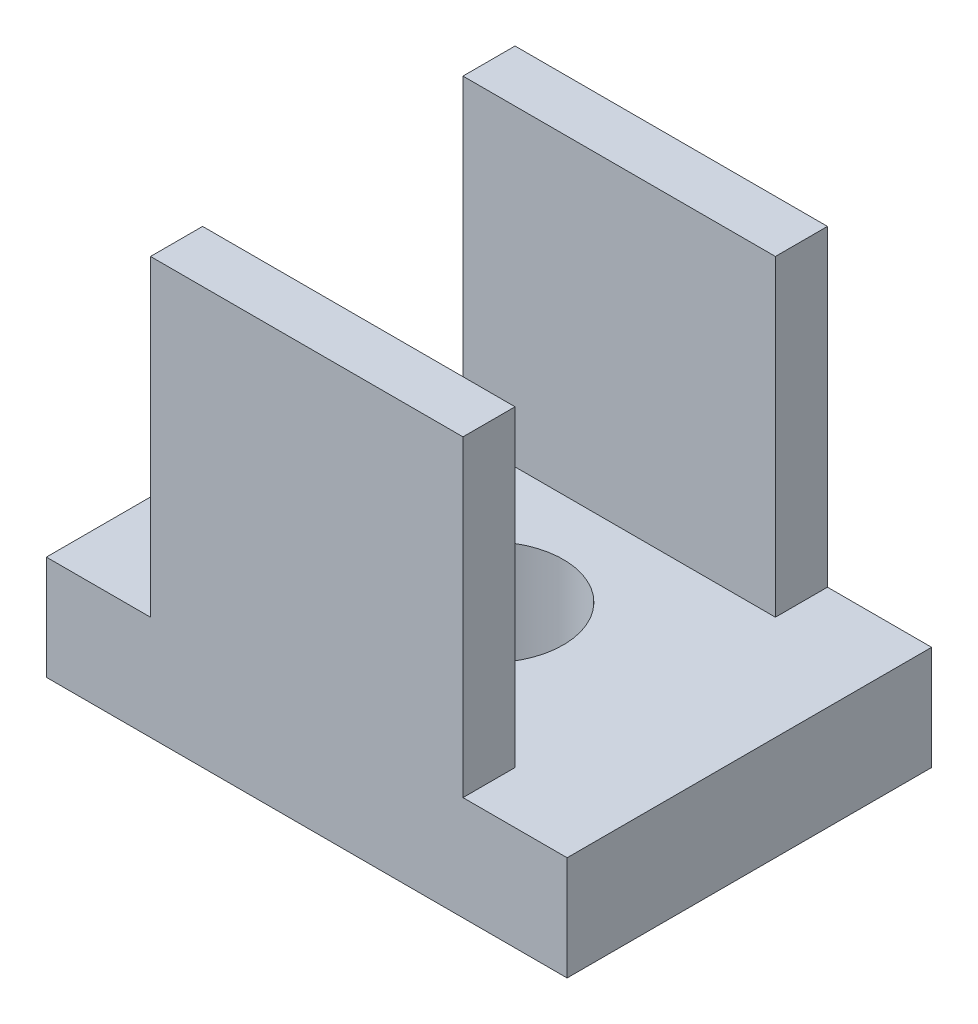
ISO-10303-21;
HEADER;
FILE_DESCRIPTION(('STEP AP214'),'2;1');
FILE_NAME('part.step','',(''),(''),'','','');
FILE_SCHEMA(('AUTOMOTIVE_DESIGN { 1 0 10303 214 1 1 1 1 }'));
ENDSEC;
DATA;
#1=APPLICATION_CONTEXT('core data for automotive mechanical design processes');
#2=APPLICATION_PROTOCOL_DEFINITION('international standard','automotive_design',2000,#1);
#3=PRODUCT_CONTEXT('',#1,'mechanical');
#4=PRODUCT('Part','Part','',(#3));
#5=PRODUCT_RELATED_PRODUCT_CATEGORY('part','',(#4));
#6=PRODUCT_DEFINITION_FORMATION('','',#4);
#7=PRODUCT_DEFINITION_CONTEXT('part definition',#1,'design');
#8=PRODUCT_DEFINITION('design','',#6,#7);
#9=PRODUCT_DEFINITION_SHAPE('','',#8);
#10=(LENGTH_UNIT() NAMED_UNIT(*) SI_UNIT(.MILLI.,.METRE.));
#11=(NAMED_UNIT(*) PLANE_ANGLE_UNIT() SI_UNIT($,.RADIAN.));
#12=(NAMED_UNIT(*) SI_UNIT($,.STERADIAN.) SOLID_ANGLE_UNIT());
#13=UNCERTAINTY_MEASURE_WITH_UNIT(LENGTH_MEASURE(1.E-05),#10,'distance_accuracy_value','');
#14=(GEOMETRIC_REPRESENTATION_CONTEXT(3) GLOBAL_UNCERTAINTY_ASSIGNED_CONTEXT((#13)) GLOBAL_UNIT_ASSIGNED_CONTEXT((#10,
#11,#12)) REPRESENTATION_CONTEXT('',''));
#15=CARTESIAN_POINT('',(0.,0.,0.));
#16=DIRECTION('',(0.,0.,1.));
#17=DIRECTION('',(1.,0.,0.));
#18=AXIS2_PLACEMENT_3D('',#15,#16,#17);
#19=CARTESIAN_POINT('',(0.,2.,0.));
#20=DIRECTION('',(0.,-1.,0.));
#21=DIRECTION('',(0.,0.,-1.));
#22=AXIS2_PLACEMENT_3D('',#19,#20,#21);
#23=PLANE('',#22);
#24=CARTESIAN_POINT('',(0.,2.,0.));
#25=DIRECTION('',(0.,1.,0.));
#26=DIRECTION('',(0.,0.,1.));
#27=AXIS2_PLACEMENT_3D('',#24,#25,#26);
#28=CIRCLE('',#27,1.425);
#29=CARTESIAN_POINT('',(0.,2.,1.425));
#30=VERTEX_POINT('',#29);
#31=EDGE_CURVE('E200',#30,#30,#28,.T.);
#32=ORIENTED_EDGE('',*,*,#31,.F.);
#33=EDGE_LOOP('',(#32));
#34=FACE_BOUND('',#33,.T.);
#35=DIRECTION('',(0.,0.,1.));
#36=VECTOR('',#35,1.);
#37=CARTESIAN_POINT('',(-3.,2.,2.5));
#38=LINE('',#37,#36);
#39=CARTESIAN_POINT('',(-3.,2.,2.5));
#40=VERTEX_POINT('',#39);
#41=CARTESIAN_POINT('',(-3.,2.,3.5));
#42=VERTEX_POINT('',#41);
#43=EDGE_CURVE('E55',#40,#42,#38,.T.);
#44=ORIENTED_EDGE('',*,*,#43,.F.);
#45=DIRECTION('',(-1.,0.,0.));
#46=VECTOR('',#45,1.);
#47=CARTESIAN_POINT('',(-3.,2.,2.5));
#48=LINE('',#47,#46);
#49=CARTESIAN_POINT('',(3.,2.,2.5));
#50=VERTEX_POINT('',#49);
#51=EDGE_CURVE('E60',#50,#40,#48,.T.);
#52=ORIENTED_EDGE('',*,*,#51,.F.);
#53=DIRECTION('',(0.,0.,-1.));
#54=VECTOR('',#53,1.);
#55=CARTESIAN_POINT('',(3.,2.,3.5));
#56=LINE('',#55,#54);
#57=CARTESIAN_POINT('',(3.,2.,3.5));
#58=VERTEX_POINT('',#57);
#59=EDGE_CURVE('E149',#58,#50,#56,.T.);
#60=ORIENTED_EDGE('',*,*,#59,.F.);
#61=DIRECTION('',(1.,0.,0.));
#62=VECTOR('',#61,1.);
#63=CARTESIAN_POINT('',(-5.,2.,3.5));
#64=LINE('',#63,#62);
#65=CARTESIAN_POINT('',(5.,2.,3.5));
#66=VERTEX_POINT('',#65);
#67=EDGE_CURVE('E221',#58,#66,#64,.T.);
#68=ORIENTED_EDGE('',*,*,#67,.T.);
#69=DIRECTION('',(0.,0.,-1.));
#70=VECTOR('',#69,1.);
#71=CARTESIAN_POINT('',(5.,2.,3.5));
#72=LINE('',#71,#70);
#73=CARTESIAN_POINT('',(5.,2.,-3.5));
#74=VERTEX_POINT('',#73);
#75=EDGE_CURVE('E209',#66,#74,#72,.T.);
#76=ORIENTED_EDGE('',*,*,#75,.T.);
#77=DIRECTION('',(-1.,0.,0.));
#78=VECTOR('',#77,1.);
#79=CARTESIAN_POINT('',(-5.,2.,-3.5));
#80=LINE('',#79,#78);
#81=CARTESIAN_POINT('',(3.,2.,-3.5));
#82=VERTEX_POINT('',#81);
#83=EDGE_CURVE('E215',#74,#82,#80,.T.);
#84=ORIENTED_EDGE('',*,*,#83,.T.);
#85=DIRECTION('',(0.,0.,-1.));
#86=VECTOR('',#85,1.);
#87=CARTESIAN_POINT('',(3.,2.,-3.5));
#88=LINE('',#87,#86);
#89=CARTESIAN_POINT('',(3.,2.,-2.5));
#90=VERTEX_POINT('',#89);
#91=EDGE_CURVE('E153',#90,#82,#88,.T.);
#92=ORIENTED_EDGE('',*,*,#91,.F.);
#93=DIRECTION('',(1.,0.,0.));
#94=VECTOR('',#93,1.);
#95=CARTESIAN_POINT('',(-3.,2.,-2.5));
#96=LINE('',#95,#94);
#97=CARTESIAN_POINT('',(-3.,2.,-2.5));
#98=VERTEX_POINT('',#97);
#99=EDGE_CURVE('E169',#98,#90,#96,.T.);
#100=ORIENTED_EDGE('',*,*,#99,.F.);
#101=DIRECTION('',(0.,0.,1.));
#102=VECTOR('',#101,1.);
#103=CARTESIAN_POINT('',(-3.,2.,-2.5));
#104=LINE('',#103,#102);
#105=CARTESIAN_POINT('',(-3.,2.,-3.5));
#106=VERTEX_POINT('',#105);
#107=EDGE_CURVE('E158',#106,#98,#104,.T.);
#108=ORIENTED_EDGE('',*,*,#107,.F.);
#109=CARTESIAN_POINT('',(-5.,2.,-3.5));
#110=VERTEX_POINT('',#109);
#111=EDGE_CURVE('E213',#106,#110,#80,.T.);
#112=ORIENTED_EDGE('',*,*,#111,.T.);
#113=DIRECTION('',(0.,0.,1.));
#114=VECTOR('',#113,1.);
#115=CARTESIAN_POINT('',(-5.,2.,3.5));
#116=LINE('',#115,#114);
#117=CARTESIAN_POINT('',(-5.,2.,3.5));
#118=VERTEX_POINT('',#117);
#119=EDGE_CURVE('E218',#110,#118,#116,.T.);
#120=ORIENTED_EDGE('',*,*,#119,.T.);
#121=EDGE_CURVE('E222',#118,#42,#64,.T.);
#122=ORIENTED_EDGE('',*,*,#121,.T.);
#123=EDGE_LOOP('',(#44,#52,#60,#68,#76,#84,#92,#100,#108,#112,#120,#122));
#124=FACE_BOUND('',#123,.T.);
#125=ADVANCED_FACE('F39',(#34,#124),#23,.F.);
#126=CARTESIAN_POINT('',(5.,2.,3.5));
#127=DIRECTION('',(-1.,0.,0.));
#128=DIRECTION('',(0.,0.,1.));
#129=AXIS2_PLACEMENT_3D('',#126,#127,#128);
#130=PLANE('',#129);
#131=DIRECTION('',(0.,0.,-1.));
#132=VECTOR('',#131,1.);
#133=CARTESIAN_POINT('',(5.,0.,3.5));
#134=LINE('',#133,#132);
#135=CARTESIAN_POINT('',(5.,0.,3.5));
#136=VERTEX_POINT('',#135);
#137=CARTESIAN_POINT('',(5.,0.,-3.5));
#138=VERTEX_POINT('',#137);
#139=EDGE_CURVE('E205',#136,#138,#134,.T.);
#140=ORIENTED_EDGE('',*,*,#139,.T.);
#141=DIRECTION('',(0.,-1.,0.));
#142=VECTOR('',#141,1.);
#143=CARTESIAN_POINT('',(5.,2.,-3.5));
#144=LINE('',#143,#142);
#145=EDGE_CURVE('E11',#74,#138,#144,.T.);
#146=ORIENTED_EDGE('',*,*,#145,.F.);
#147=ORIENTED_EDGE('',*,*,#75,.F.);
#148=DIRECTION('',(0.,-1.,0.));
#149=VECTOR('',#148,1.);
#150=CARTESIAN_POINT('',(5.,2.,3.5));
#151=LINE('',#150,#149);
#152=EDGE_CURVE('E225',#66,#136,#151,.T.);
#153=ORIENTED_EDGE('',*,*,#152,.T.);
#154=EDGE_LOOP('',(#140,#146,#147,#153));
#155=FACE_BOUND('',#154,.T.);
#156=ADVANCED_FACE('F41',(#155),#130,.F.);
#157=CARTESIAN_POINT('',(-5.,2.,-3.5));
#158=DIRECTION('',(0.,0.,1.));
#159=DIRECTION('',(1.,0.,0.));
#160=AXIS2_PLACEMENT_3D('',#157,#158,#159);
#161=PLANE('',#160);
#162=DIRECTION('',(-1.,0.,0.));
#163=VECTOR('',#162,1.);
#164=CARTESIAN_POINT('',(-5.,0.,-3.5));
#165=LINE('',#164,#163);
#166=CARTESIAN_POINT('',(-5.,0.,-3.5));
#167=VERTEX_POINT('',#166);
#168=EDGE_CURVE('E229',#138,#167,#165,.T.);
#169=ORIENTED_EDGE('',*,*,#168,.T.);
#170=DIRECTION('',(0.,-1.,0.));
#171=VECTOR('',#170,1.);
#172=CARTESIAN_POINT('',(-5.,2.,-3.5));
#173=LINE('',#172,#171);
#174=EDGE_CURVE('E48',#110,#167,#173,.T.);
#175=ORIENTED_EDGE('',*,*,#174,.F.);
#176=ORIENTED_EDGE('',*,*,#111,.F.);
#177=DIRECTION('',(0.,-1.,0.));
#178=VECTOR('',#177,1.);
#179=CARTESIAN_POINT('',(-3.,8.,-3.5));
#180=LINE('',#179,#178);
#181=CARTESIAN_POINT('',(-3.,8.,-3.5));
#182=VERTEX_POINT('',#181);
#183=EDGE_CURVE('E192',#182,#106,#180,.T.);
#184=ORIENTED_EDGE('',*,*,#183,.F.);
#185=DIRECTION('',(-1.,0.,0.));
#186=VECTOR('',#185,1.);
#187=CARTESIAN_POINT('',(-3.,8.,-3.5));
#188=LINE('',#187,#186);
#189=CARTESIAN_POINT('',(3.,8.,-3.5));
#190=VERTEX_POINT('',#189);
#191=EDGE_CURVE('E168',#190,#182,#188,.T.);
#192=ORIENTED_EDGE('',*,*,#191,.F.);
#193=DIRECTION('',(0.,-1.,0.));
#194=VECTOR('',#193,1.);
#195=CARTESIAN_POINT('',(3.,8.,-3.5));
#196=LINE('',#195,#194);
#197=EDGE_CURVE('E196',#190,#82,#196,.T.);
#198=ORIENTED_EDGE('',*,*,#197,.T.);
#199=ORIENTED_EDGE('',*,*,#83,.F.);
#200=ORIENTED_EDGE('',*,*,#145,.T.);
#201=EDGE_LOOP('',(#169,#175,#176,#184,#192,#198,#199,#200));
#202=FACE_BOUND('',#201,.T.);
#203=ADVANCED_FACE('F269',(#202),#161,.F.);
#204=CARTESIAN_POINT('',(-5.,2.,3.5));
#205=DIRECTION('',(1.,0.,0.));
#206=DIRECTION('',(0.,0.,-1.));
#207=AXIS2_PLACEMENT_3D('',#204,#205,#206);
#208=PLANE('',#207);
#209=DIRECTION('',(0.,0.,1.));
#210=VECTOR('',#209,1.);
#211=CARTESIAN_POINT('',(-5.,0.,3.5));
#212=LINE('',#211,#210);
#213=CARTESIAN_POINT('',(-5.,0.,3.5));
#214=VERTEX_POINT('',#213);
#215=EDGE_CURVE('E232',#167,#214,#212,.T.);
#216=ORIENTED_EDGE('',*,*,#215,.T.);
#217=DIRECTION('',(0.,-1.,0.));
#218=VECTOR('',#217,1.);
#219=CARTESIAN_POINT('',(-5.,2.,3.5));
#220=LINE('',#219,#218);
#221=EDGE_CURVE('E240',#118,#214,#220,.T.);
#222=ORIENTED_EDGE('',*,*,#221,.F.);
#223=ORIENTED_EDGE('',*,*,#119,.F.);
#224=ORIENTED_EDGE('',*,*,#174,.T.);
#225=EDGE_LOOP('',(#216,#222,#223,#224));
#226=FACE_BOUND('',#225,.T.);
#227=ADVANCED_FACE('F249',(#226),#208,.F.);
#228=CARTESIAN_POINT('',(-5.,2.,3.5));
#229=DIRECTION('',(0.,0.,-1.));
#230=DIRECTION('',(-1.,0.,0.));
#231=AXIS2_PLACEMENT_3D('',#228,#229,#230);
#232=PLANE('',#231);
#233=DIRECTION('',(1.,0.,0.));
#234=VECTOR('',#233,1.);
#235=CARTESIAN_POINT('',(-5.,0.,3.5));
#236=LINE('',#235,#234);
#237=EDGE_CURVE('E214',#214,#136,#236,.T.);
#238=ORIENTED_EDGE('',*,*,#237,.T.);
#239=ORIENTED_EDGE('',*,*,#152,.F.);
#240=ORIENTED_EDGE('',*,*,#67,.F.);
#241=DIRECTION('',(0.,-1.,0.));
#242=VECTOR('',#241,1.);
#243=CARTESIAN_POINT('',(3.,8.,3.5));
#244=LINE('',#243,#242);
#245=CARTESIAN_POINT('',(3.,8.,3.5));
#246=VERTEX_POINT('',#245);
#247=EDGE_CURVE('E160',#246,#58,#244,.T.);
#248=ORIENTED_EDGE('',*,*,#247,.F.);
#249=DIRECTION('',(1.,0.,0.));
#250=VECTOR('',#249,1.);
#251=CARTESIAN_POINT('',(-3.,8.,3.5));
#252=LINE('',#251,#250);
#253=CARTESIAN_POINT('',(-3.,8.,3.5));
#254=VERTEX_POINT('',#253);
#255=EDGE_CURVE('E138',#254,#246,#252,.T.);
#256=ORIENTED_EDGE('',*,*,#255,.F.);
#257=DIRECTION('',(0.,-1.,0.));
#258=VECTOR('',#257,1.);
#259=CARTESIAN_POINT('',(-3.,8.,3.5));
#260=LINE('',#259,#258);
#261=EDGE_CURVE('E134',#254,#42,#260,.T.);
#262=ORIENTED_EDGE('',*,*,#261,.T.);
#263=ORIENTED_EDGE('',*,*,#121,.F.);
#264=ORIENTED_EDGE('',*,*,#221,.T.);
#265=EDGE_LOOP('',(#238,#239,#240,#248,#256,#262,#263,#264));
#266=FACE_BOUND('',#265,.T.);
#267=ADVANCED_FACE('F259',(#266),#232,.F.);
#268=CARTESIAN_POINT('',(0.,0.,0.));
#269=DIRECTION('',(0.,-1.,0.));
#270=DIRECTION('',(0.,0.,-1.));
#271=AXIS2_PLACEMENT_3D('',#268,#269,#270);
#272=PLANE('',#271);
#273=CARTESIAN_POINT('',(0.,0.,0.));
#274=DIRECTION('',(0.,1.,0.));
#275=DIRECTION('',(0.,0.,1.));
#276=AXIS2_PLACEMENT_3D('',#273,#274,#275);
#277=CIRCLE('',#276,1.425);
#278=CARTESIAN_POINT('',(0.,0.,1.425));
#279=VERTEX_POINT('',#278);
#280=EDGE_CURVE('E201',#279,#279,#277,.T.);
#281=ORIENTED_EDGE('',*,*,#280,.T.);
#282=EDGE_LOOP('',(#281));
#283=FACE_BOUND('',#282,.T.);
#284=ORIENTED_EDGE('',*,*,#139,.F.);
#285=ORIENTED_EDGE('',*,*,#237,.F.);
#286=ORIENTED_EDGE('',*,*,#215,.F.);
#287=ORIENTED_EDGE('',*,*,#168,.F.);
#288=EDGE_LOOP('',(#284,#285,#286,#287));
#289=FACE_BOUND('',#288,.T.);
#290=ADVANCED_FACE('F256',(#283,#289),#272,.T.);
#291=CARTESIAN_POINT('',(0.,0.,0.));
#292=DIRECTION('',(0.,1.,0.));
#293=DIRECTION('',(0.,0.,1.));
#294=AXIS2_PLACEMENT_3D('',#291,#292,#293);
#295=CYLINDRICAL_SURFACE('',#294,1.425);
#296=ORIENTED_EDGE('',*,*,#280,.F.);
#297=EDGE_LOOP('',(#296));
#298=FACE_BOUND('',#297,.T.);
#299=ORIENTED_EDGE('',*,*,#31,.T.);
#300=EDGE_LOOP('',(#299));
#301=FACE_BOUND('',#300,.T.);
#302=ADVANCED_FACE('F301',(#298,#301),#295,.F.);
#303=CARTESIAN_POINT('',(3.,8.,-3.5));
#304=DIRECTION('',(-1.,0.,0.));
#305=DIRECTION('',(0.,0.,1.));
#306=AXIS2_PLACEMENT_3D('',#303,#304,#305);
#307=PLANE('',#306);
#308=ORIENTED_EDGE('',*,*,#91,.T.);
#309=ORIENTED_EDGE('',*,*,#197,.F.);
#310=DIRECTION('',(0.,0.,-1.));
#311=VECTOR('',#310,1.);
#312=CARTESIAN_POINT('',(3.,8.,-3.5));
#313=LINE('',#312,#311);
#314=CARTESIAN_POINT('',(3.,8.,-2.5));
#315=VERTEX_POINT('',#314);
#316=EDGE_CURVE('E164',#315,#190,#313,.T.);
#317=ORIENTED_EDGE('',*,*,#316,.F.);
#318=DIRECTION('',(0.,-1.,0.));
#319=VECTOR('',#318,1.);
#320=CARTESIAN_POINT('',(3.,8.,-2.5));
#321=LINE('',#320,#319);
#322=EDGE_CURVE('E177',#315,#90,#321,.T.);
#323=ORIENTED_EDGE('',*,*,#322,.T.);
#324=EDGE_LOOP('',(#308,#309,#317,#323));
#325=FACE_BOUND('',#324,.T.);
#326=ADVANCED_FACE('F281',(#325),#307,.F.);
#327=CARTESIAN_POINT('',(-3.,8.,-2.5));
#328=DIRECTION('',(1.,0.,0.));
#329=DIRECTION('',(0.,0.,-1.));
#330=AXIS2_PLACEMENT_3D('',#327,#328,#329);
#331=PLANE('',#330);
#332=ORIENTED_EDGE('',*,*,#107,.T.);
#333=DIRECTION('',(0.,-1.,0.));
#334=VECTOR('',#333,1.);
#335=CARTESIAN_POINT('',(-3.,8.,-2.5));
#336=LINE('',#335,#334);
#337=CARTESIAN_POINT('',(-3.,8.,-2.5));
#338=VERTEX_POINT('',#337);
#339=EDGE_CURVE('E188',#338,#98,#336,.T.);
#340=ORIENTED_EDGE('',*,*,#339,.F.);
#341=DIRECTION('',(0.,0.,1.));
#342=VECTOR('',#341,1.);
#343=CARTESIAN_POINT('',(-3.,8.,-2.5));
#344=LINE('',#343,#342);
#345=EDGE_CURVE('E172',#182,#338,#344,.T.);
#346=ORIENTED_EDGE('',*,*,#345,.F.);
#347=ORIENTED_EDGE('',*,*,#183,.T.);
#348=EDGE_LOOP('',(#332,#340,#346,#347));
#349=FACE_BOUND('',#348,.T.);
#350=ADVANCED_FACE('F272',(#349),#331,.F.);
#351=CARTESIAN_POINT('',(-3.,8.,-2.5));
#352=DIRECTION('',(0.,0.,-1.));
#353=DIRECTION('',(-1.,0.,0.));
#354=AXIS2_PLACEMENT_3D('',#351,#352,#353);
#355=PLANE('',#354);
#356=ORIENTED_EDGE('',*,*,#99,.T.);
#357=ORIENTED_EDGE('',*,*,#322,.F.);
#358=DIRECTION('',(1.,0.,0.));
#359=VECTOR('',#358,1.);
#360=CARTESIAN_POINT('',(-3.,8.,-2.5));
#361=LINE('',#360,#359);
#362=EDGE_CURVE('E175',#338,#315,#361,.T.);
#363=ORIENTED_EDGE('',*,*,#362,.F.);
#364=ORIENTED_EDGE('',*,*,#339,.T.);
#365=EDGE_LOOP('',(#356,#357,#363,#364));
#366=FACE_BOUND('',#365,.T.);
#367=ADVANCED_FACE('F283',(#366),#355,.F.);
#368=CARTESIAN_POINT('',(0.,8.,0.));
#369=DIRECTION('',(0.,1.,0.));
#370=DIRECTION('',(0.,0.,1.));
#371=AXIS2_PLACEMENT_3D('',#368,#369,#370);
#372=PLANE('',#371);
#373=ORIENTED_EDGE('',*,*,#316,.T.);
#374=ORIENTED_EDGE('',*,*,#191,.T.);
#375=ORIENTED_EDGE('',*,*,#345,.T.);
#376=ORIENTED_EDGE('',*,*,#362,.T.);
#377=EDGE_LOOP('',(#373,#374,#375,#376));
#378=FACE_BOUND('',#377,.T.);
#379=ADVANCED_FACE('F276',(#378),#372,.T.);
#380=CARTESIAN_POINT('',(-3.,8.,2.5));
#381=DIRECTION('',(0.,0.,1.));
#382=DIRECTION('',(1.,0.,0.));
#383=AXIS2_PLACEMENT_3D('',#380,#381,#382);
#384=PLANE('',#383);
#385=ORIENTED_EDGE('',*,*,#51,.T.);
#386=DIRECTION('',(0.,-1.,0.));
#387=VECTOR('',#386,1.);
#388=CARTESIAN_POINT('',(-3.,8.,2.5));
#389=LINE('',#388,#387);
#390=CARTESIAN_POINT('',(-3.,8.,2.5));
#391=VERTEX_POINT('',#390);
#392=EDGE_CURVE('E132',#391,#40,#389,.T.);
#393=ORIENTED_EDGE('',*,*,#392,.F.);
#394=DIRECTION('',(-1.,0.,0.));
#395=VECTOR('',#394,1.);
#396=CARTESIAN_POINT('',(-3.,8.,2.5));
#397=LINE('',#396,#395);
#398=CARTESIAN_POINT('',(3.,8.,2.5));
#399=VERTEX_POINT('',#398);
#400=EDGE_CURVE('E139',#399,#391,#397,.T.);
#401=ORIENTED_EDGE('',*,*,#400,.F.);
#402=DIRECTION('',(0.,-1.,0.));
#403=VECTOR('',#402,1.);
#404=CARTESIAN_POINT('',(3.,8.,2.5));
#405=LINE('',#404,#403);
#406=EDGE_CURVE('E389',#399,#50,#405,.T.);
#407=ORIENTED_EDGE('',*,*,#406,.T.);
#408=EDGE_LOOP('',(#385,#393,#401,#407));
#409=FACE_BOUND('',#408,.T.);
#410=ADVANCED_FACE('F151',(#409),#384,.F.);
#411=CARTESIAN_POINT('',(-3.,8.,2.5));
#412=DIRECTION('',(1.,0.,0.));
#413=DIRECTION('',(0.,0.,-1.));
#414=AXIS2_PLACEMENT_3D('',#411,#412,#413);
#415=PLANE('',#414);
#416=ORIENTED_EDGE('',*,*,#43,.T.);
#417=ORIENTED_EDGE('',*,*,#261,.F.);
#418=DIRECTION('',(0.,0.,1.));
#419=VECTOR('',#418,1.);
#420=CARTESIAN_POINT('',(-3.,8.,2.5));
#421=LINE('',#420,#419);
#422=EDGE_CURVE('E128',#391,#254,#421,.T.);
#423=ORIENTED_EDGE('',*,*,#422,.F.);
#424=ORIENTED_EDGE('',*,*,#392,.T.);
#425=EDGE_LOOP('',(#416,#417,#423,#424));
#426=FACE_BOUND('',#425,.T.);
#427=ADVANCED_FACE('F130',(#426),#415,.F.);
#428=CARTESIAN_POINT('',(3.,8.,3.5));
#429=DIRECTION('',(-1.,0.,0.));
#430=DIRECTION('',(0.,0.,1.));
#431=AXIS2_PLACEMENT_3D('',#428,#429,#430);
#432=PLANE('',#431);
#433=ORIENTED_EDGE('',*,*,#59,.T.);
#434=ORIENTED_EDGE('',*,*,#406,.F.);
#435=DIRECTION('',(0.,0.,-1.));
#436=VECTOR('',#435,1.);
#437=CARTESIAN_POINT('',(3.,8.,3.5));
#438=LINE('',#437,#436);
#439=EDGE_CURVE('E144',#246,#399,#438,.T.);
#440=ORIENTED_EDGE('',*,*,#439,.F.);
#441=ORIENTED_EDGE('',*,*,#247,.T.);
#442=EDGE_LOOP('',(#433,#434,#440,#441));
#443=FACE_BOUND('',#442,.T.);
#444=ADVANCED_FACE('F368',(#443),#432,.F.);
#445=CARTESIAN_POINT('',(0.,8.,0.));
#446=DIRECTION('',(0.,1.,0.));
#447=DIRECTION('',(0.,0.,1.));
#448=AXIS2_PLACEMENT_3D('',#445,#446,#447);
#449=PLANE('',#448);
#450=ORIENTED_EDGE('',*,*,#400,.T.);
#451=ORIENTED_EDGE('',*,*,#422,.T.);
#452=ORIENTED_EDGE('',*,*,#255,.T.);
#453=ORIENTED_EDGE('',*,*,#439,.T.);
#454=EDGE_LOOP('',(#450,#451,#452,#453));
#455=FACE_BOUND('',#454,.T.);
#456=ADVANCED_FACE('F142',(#455),#449,.T.);
#457=CLOSED_SHELL('',(#125,#156,#203,#227,#267,#290,#302,#326,#350,#367,#379,#410,#427,#444,#456));
#458=MANIFOLD_SOLID_BREP('B2',#457);
#459=ADVANCED_BREP_SHAPE_REPRESENTATION('',(#18,#458),#14);
#460=SHAPE_DEFINITION_REPRESENTATION(#9,#459);
ENDSEC;
END-ISO-10303-21;
